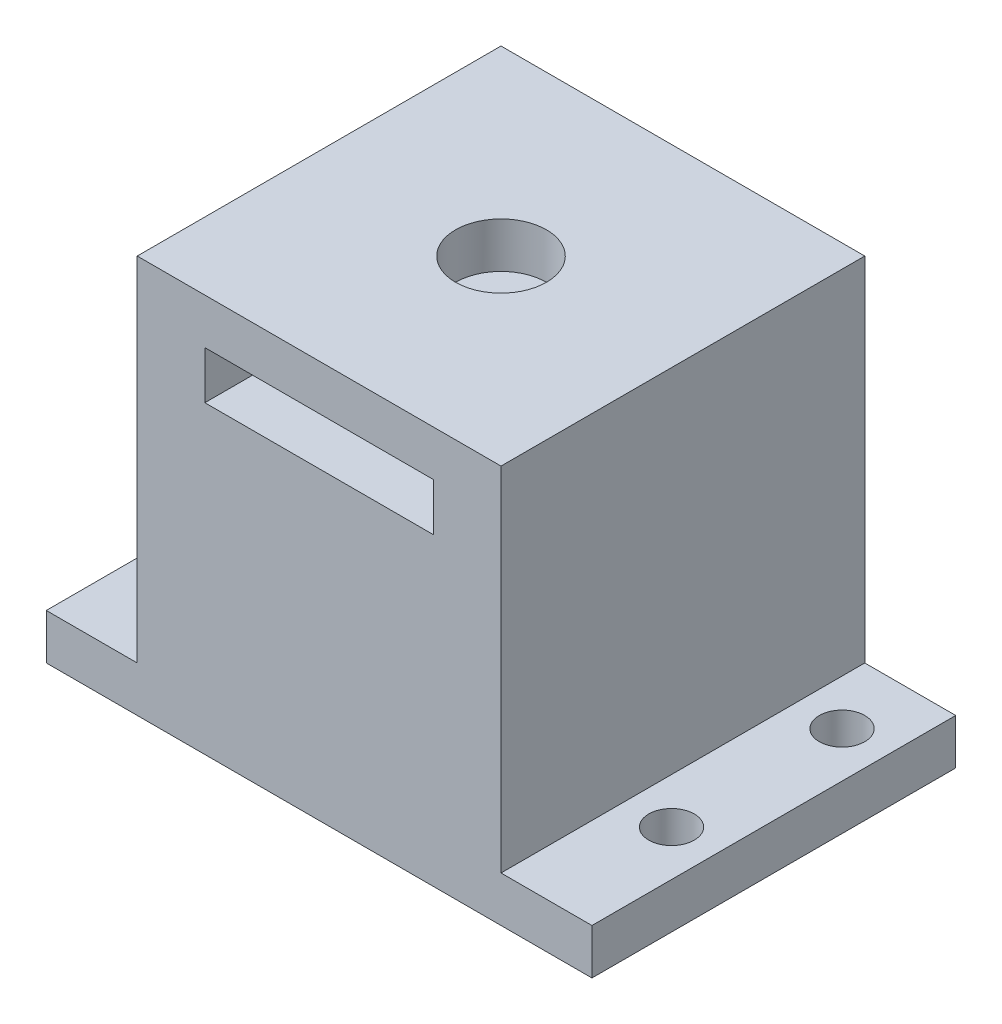
ISO-10303-21;
HEADER;
FILE_DESCRIPTION(('STEP AP214'),'2;1');
FILE_NAME('part.step','',(''),(''),'','','');
FILE_SCHEMA(('AUTOMOTIVE_DESIGN { 1 0 10303 214 1 1 1 1 }'));
ENDSEC;
DATA;
#1=APPLICATION_CONTEXT('core data for automotive mechanical design processes');
#2=APPLICATION_PROTOCOL_DEFINITION('international standard','automotive_design',2000,#1);
#3=PRODUCT_CONTEXT('',#1,'mechanical');
#4=PRODUCT('Part','Part','',(#3));
#5=PRODUCT_RELATED_PRODUCT_CATEGORY('part','',(#4));
#6=PRODUCT_DEFINITION_FORMATION('','',#4);
#7=PRODUCT_DEFINITION_CONTEXT('part definition',#1,'design');
#8=PRODUCT_DEFINITION('design','',#6,#7);
#9=PRODUCT_DEFINITION_SHAPE('','',#8);
#10=(LENGTH_UNIT() NAMED_UNIT(*) SI_UNIT(.MILLI.,.METRE.));
#11=(NAMED_UNIT(*) PLANE_ANGLE_UNIT() SI_UNIT($,.RADIAN.));
#12=(NAMED_UNIT(*) SI_UNIT($,.STERADIAN.) SOLID_ANGLE_UNIT());
#13=UNCERTAINTY_MEASURE_WITH_UNIT(LENGTH_MEASURE(1.E-05),#10,'distance_accuracy_value','');
#14=(GEOMETRIC_REPRESENTATION_CONTEXT(3) GLOBAL_UNCERTAINTY_ASSIGNED_CONTEXT((#13)) GLOBAL_UNIT_ASSIGNED_CONTEXT((#10,
#11,#12)) REPRESENTATION_CONTEXT('',''));
#15=CARTESIAN_POINT('',(0.,0.,0.));
#16=DIRECTION('',(0.,0.,1.));
#17=DIRECTION('',(1.,0.,0.));
#18=AXIS2_PLACEMENT_3D('',#15,#16,#17);
#19=CARTESIAN_POINT('',(16.,35.,16.));
#20=DIRECTION('',(-1.,0.,0.));
#21=DIRECTION('',(0.,0.,1.));
#22=AXIS2_PLACEMENT_3D('',#19,#20,#21);
#23=PLANE('',#22);
#24=DIRECTION('',(0.,0.,1.));
#25=VECTOR('',#24,1.);
#26=CARTESIAN_POINT('',(16.,4.,16.));
#27=LINE('',#26,#25);
#28=CARTESIAN_POINT('',(16.,4.,-16.));
#29=VERTEX_POINT('',#28);
#30=CARTESIAN_POINT('',(16.,4.,16.));
#31=VERTEX_POINT('',#30);
#32=EDGE_CURVE('E170',#29,#31,#27,.T.);
#33=ORIENTED_EDGE('',*,*,#32,.F.);
#34=DIRECTION('',(0.,-1.,0.));
#35=VECTOR('',#34,1.);
#36=CARTESIAN_POINT('',(16.,35.,-16.));
#37=LINE('',#36,#35);
#38=CARTESIAN_POINT('',(16.,35.,-16.));
#39=VERTEX_POINT('',#38);
#40=EDGE_CURVE('E11',#39,#29,#37,.T.);
#41=ORIENTED_EDGE('',*,*,#40,.F.);
#42=DIRECTION('',(0.,0.,-1.));
#43=VECTOR('',#42,1.);
#44=CARTESIAN_POINT('',(16.,35.,16.));
#45=LINE('',#44,#43);
#46=CARTESIAN_POINT('',(16.,35.,16.));
#47=VERTEX_POINT('',#46);
#48=EDGE_CURVE('E222',#47,#39,#45,.T.);
#49=ORIENTED_EDGE('',*,*,#48,.F.);
#50=DIRECTION('',(0.,-1.,0.));
#51=VECTOR('',#50,1.);
#52=CARTESIAN_POINT('',(16.,35.,16.));
#53=LINE('',#52,#51);
#54=EDGE_CURVE('E232',#47,#31,#53,.T.);
#55=ORIENTED_EDGE('',*,*,#54,.T.);
#56=EDGE_LOOP('',(#33,#41,#49,#55));
#57=FACE_BOUND('',#56,.T.);
#58=ADVANCED_FACE('F33',(#57),#23,.F.);
#59=CARTESIAN_POINT('',(-16.,35.,-16.));
#60=DIRECTION('',(0.,0.,1.));
#61=DIRECTION('',(1.,0.,0.));
#62=AXIS2_PLACEMENT_3D('',#59,#60,#61);
#63=PLANE('',#62);
#64=DIRECTION('',(-1.,0.,0.));
#65=VECTOR('',#64,1.);
#66=CARTESIAN_POINT('',(10.05,26.8,-16.));
#67=LINE('',#66,#65);
#68=CARTESIAN_POINT('',(10.05,26.8,-16.));
#69=VERTEX_POINT('',#68);
#70=CARTESIAN_POINT('',(-10.05,26.8,-16.));
#71=VERTEX_POINT('',#70);
#72=EDGE_CURVE('E143',#69,#71,#67,.T.);
#73=ORIENTED_EDGE('',*,*,#72,.F.);
#74=DIRECTION('',(0.,-1.,0.));
#75=VECTOR('',#74,1.);
#76=CARTESIAN_POINT('',(10.05,26.8,-16.));
#77=LINE('',#76,#75);
#78=CARTESIAN_POINT('',(10.05,31.,-16.));
#79=VERTEX_POINT('',#78);
#80=EDGE_CURVE('E47',#79,#69,#77,.T.);
#81=ORIENTED_EDGE('',*,*,#80,.F.);
#82=DIRECTION('',(1.,0.,0.));
#83=VECTOR('',#82,1.);
#84=CARTESIAN_POINT('',(10.05,31.,-16.));
#85=LINE('',#84,#83);
#86=CARTESIAN_POINT('',(-10.05,31.,-16.));
#87=VERTEX_POINT('',#86);
#88=EDGE_CURVE('E129',#87,#79,#85,.T.);
#89=ORIENTED_EDGE('',*,*,#88,.F.);
#90=DIRECTION('',(0.,1.,0.));
#91=VECTOR('',#90,1.);
#92=CARTESIAN_POINT('',(-10.05,26.8,-16.));
#93=LINE('',#92,#91);
#94=EDGE_CURVE('E149',#71,#87,#93,.T.);
#95=ORIENTED_EDGE('',*,*,#94,.F.);
#96=EDGE_LOOP('',(#73,#81,#89,#95));
#97=FACE_BOUND('',#96,.T.);
#98=DIRECTION('',(-1.,0.,0.));
#99=VECTOR('',#98,1.);
#100=CARTESIAN_POINT('',(-16.,0.,-16.));
#101=LINE('',#100,#99);
#102=CARTESIAN_POINT('',(24.,0.,-16.));
#103=VERTEX_POINT('',#102);
#104=CARTESIAN_POINT('',(-24.,0.,-16.));
#105=VERTEX_POINT('',#104);
#106=EDGE_CURVE('E219',#103,#105,#101,.T.);
#107=ORIENTED_EDGE('',*,*,#106,.T.);
#108=DIRECTION('',(0.,-1.,0.));
#109=VECTOR('',#108,1.);
#110=CARTESIAN_POINT('',(-24.,4.,-16.));
#111=LINE('',#110,#109);
#112=CARTESIAN_POINT('',(-24.,4.,-16.));
#113=VERTEX_POINT('',#112);
#114=EDGE_CURVE('E216',#113,#105,#111,.T.);
#115=ORIENTED_EDGE('',*,*,#114,.F.);
#116=DIRECTION('',(1.,0.,0.));
#117=VECTOR('',#116,1.);
#118=CARTESIAN_POINT('',(-16.,4.,-16.));
#119=LINE('',#118,#117);
#120=CARTESIAN_POINT('',(-16.,4.,-16.));
#121=VERTEX_POINT('',#120);
#122=EDGE_CURVE('E210',#113,#121,#119,.T.);
#123=ORIENTED_EDGE('',*,*,#122,.T.);
#124=DIRECTION('',(0.,-1.,0.));
#125=VECTOR('',#124,1.);
#126=CARTESIAN_POINT('',(-16.,35.,-16.));
#127=LINE('',#126,#125);
#128=CARTESIAN_POINT('',(-16.,35.,-16.));
#129=VERTEX_POINT('',#128);
#130=EDGE_CURVE('E40',#129,#121,#127,.T.);
#131=ORIENTED_EDGE('',*,*,#130,.F.);
#132=DIRECTION('',(-1.,0.,0.));
#133=VECTOR('',#132,1.);
#134=CARTESIAN_POINT('',(-16.,35.,-16.));
#135=LINE('',#134,#133);
#136=EDGE_CURVE('E225',#39,#129,#135,.T.);
#137=ORIENTED_EDGE('',*,*,#136,.F.);
#138=ORIENTED_EDGE('',*,*,#40,.T.);
#139=DIRECTION('',(-1.,0.,0.));
#140=VECTOR('',#139,1.);
#141=CARTESIAN_POINT('',(16.,4.,-16.));
#142=LINE('',#141,#140);
#143=CARTESIAN_POINT('',(24.,4.,-16.));
#144=VERTEX_POINT('',#143);
#145=EDGE_CURVE('E173',#144,#29,#142,.T.);
#146=ORIENTED_EDGE('',*,*,#145,.F.);
#147=DIRECTION('',(0.,-1.,0.));
#148=VECTOR('',#147,1.);
#149=CARTESIAN_POINT('',(24.,4.,-16.));
#150=LINE('',#149,#148);
#151=EDGE_CURVE('E180',#144,#103,#150,.T.);
#152=ORIENTED_EDGE('',*,*,#151,.T.);
#153=EDGE_LOOP('',(#107,#115,#123,#131,#137,#138,#146,#152));
#154=FACE_BOUND('',#153,.T.);
#155=ADVANCED_FACE('F245',(#97,#154),#63,.F.);
#156=CARTESIAN_POINT('',(-16.,35.,16.));
#157=DIRECTION('',(1.,0.,0.));
#158=DIRECTION('',(0.,0.,-1.));
#159=AXIS2_PLACEMENT_3D('',#156,#157,#158);
#160=PLANE('',#159);
#161=ORIENTED_EDGE('',*,*,#130,.T.);
#162=DIRECTION('',(0.,0.,1.));
#163=VECTOR('',#162,1.);
#164=CARTESIAN_POINT('',(-16.,4.,16.));
#165=LINE('',#164,#163);
#166=CARTESIAN_POINT('',(-16.,4.,16.));
#167=VERTEX_POINT('',#166);
#168=EDGE_CURVE('E201',#121,#167,#165,.T.);
#169=ORIENTED_EDGE('',*,*,#168,.T.);
#170=DIRECTION('',(0.,-1.,0.));
#171=VECTOR('',#170,1.);
#172=CARTESIAN_POINT('',(-16.,35.,16.));
#173=LINE('',#172,#171);
#174=CARTESIAN_POINT('',(-16.,35.,16.));
#175=VERTEX_POINT('',#174);
#176=EDGE_CURVE('E236',#175,#167,#173,.T.);
#177=ORIENTED_EDGE('',*,*,#176,.F.);
#178=DIRECTION('',(0.,0.,1.));
#179=VECTOR('',#178,1.);
#180=CARTESIAN_POINT('',(-16.,35.,16.));
#181=LINE('',#180,#179);
#182=EDGE_CURVE('E228',#129,#175,#181,.T.);
#183=ORIENTED_EDGE('',*,*,#182,.F.);
#184=EDGE_LOOP('',(#161,#169,#177,#183));
#185=FACE_BOUND('',#184,.T.);
#186=ADVANCED_FACE('F242',(#185),#160,.F.);
#187=CARTESIAN_POINT('',(-16.,35.,16.));
#188=DIRECTION('',(0.,0.,-1.));
#189=DIRECTION('',(-1.,0.,0.));
#190=AXIS2_PLACEMENT_3D('',#187,#188,#189);
#191=PLANE('',#190);
#192=DIRECTION('',(-1.,0.,0.));
#193=VECTOR('',#192,1.);
#194=CARTESIAN_POINT('',(10.05,31.,16.));
#195=LINE('',#194,#193);
#196=CARTESIAN_POINT('',(10.05,31.,16.));
#197=VERTEX_POINT('',#196);
#198=CARTESIAN_POINT('',(-10.05,31.,16.));
#199=VERTEX_POINT('',#198);
#200=EDGE_CURVE('E141',#197,#199,#195,.T.);
#201=ORIENTED_EDGE('',*,*,#200,.F.);
#202=DIRECTION('',(0.,1.,0.));
#203=VECTOR('',#202,1.);
#204=CARTESIAN_POINT('',(10.05,26.8,16.));
#205=LINE('',#204,#203);
#206=CARTESIAN_POINT('',(10.05,26.8,16.));
#207=VERTEX_POINT('',#206);
#208=EDGE_CURVE('E123',#207,#197,#205,.T.);
#209=ORIENTED_EDGE('',*,*,#208,.F.);
#210=DIRECTION('',(1.,0.,0.));
#211=VECTOR('',#210,1.);
#212=CARTESIAN_POINT('',(10.05,26.8,16.));
#213=LINE('',#212,#211);
#214=CARTESIAN_POINT('',(-10.05,26.8,16.));
#215=VERTEX_POINT('',#214);
#216=EDGE_CURVE('E132',#215,#207,#213,.T.);
#217=ORIENTED_EDGE('',*,*,#216,.F.);
#218=DIRECTION('',(0.,-1.,0.));
#219=VECTOR('',#218,1.);
#220=CARTESIAN_POINT('',(-10.05,26.8,16.));
#221=LINE('',#220,#219);
#222=EDGE_CURVE('E55',#199,#215,#221,.T.);
#223=ORIENTED_EDGE('',*,*,#222,.F.);
#224=EDGE_LOOP('',(#201,#209,#217,#223));
#225=FACE_BOUND('',#224,.T.);
#226=DIRECTION('',(1.,0.,0.));
#227=VECTOR('',#226,1.);
#228=CARTESIAN_POINT('',(-16.,0.,16.));
#229=LINE('',#228,#227);
#230=CARTESIAN_POINT('',(-24.,0.,16.));
#231=VERTEX_POINT('',#230);
#232=CARTESIAN_POINT('',(24.,0.,16.));
#233=VERTEX_POINT('',#232);
#234=EDGE_CURVE('E226',#231,#233,#229,.T.);
#235=ORIENTED_EDGE('',*,*,#234,.T.);
#236=DIRECTION('',(0.,-1.,0.));
#237=VECTOR('',#236,1.);
#238=CARTESIAN_POINT('',(24.,4.,16.));
#239=LINE('',#238,#237);
#240=CARTESIAN_POINT('',(24.,4.,16.));
#241=VERTEX_POINT('',#240);
#242=EDGE_CURVE('E183',#241,#233,#239,.T.);
#243=ORIENTED_EDGE('',*,*,#242,.F.);
#244=DIRECTION('',(1.,0.,0.));
#245=VECTOR('',#244,1.);
#246=CARTESIAN_POINT('',(16.,4.,16.));
#247=LINE('',#246,#245);
#248=EDGE_CURVE('E178',#31,#241,#247,.T.);
#249=ORIENTED_EDGE('',*,*,#248,.F.);
#250=ORIENTED_EDGE('',*,*,#54,.F.);
#251=DIRECTION('',(1.,0.,0.));
#252=VECTOR('',#251,1.);
#253=CARTESIAN_POINT('',(-16.,35.,16.));
#254=LINE('',#253,#252);
#255=EDGE_CURVE('E230',#175,#47,#254,.T.);
#256=ORIENTED_EDGE('',*,*,#255,.F.);
#257=ORIENTED_EDGE('',*,*,#176,.T.);
#258=DIRECTION('',(-1.,0.,0.));
#259=VECTOR('',#258,1.);
#260=CARTESIAN_POINT('',(-16.,4.,16.));
#261=LINE('',#260,#259);
#262=CARTESIAN_POINT('',(-24.,4.,16.));
#263=VERTEX_POINT('',#262);
#264=EDGE_CURVE('E204',#167,#263,#261,.T.);
#265=ORIENTED_EDGE('',*,*,#264,.T.);
#266=DIRECTION('',(0.,-1.,0.));
#267=VECTOR('',#266,1.);
#268=CARTESIAN_POINT('',(-24.,4.,16.));
#269=LINE('',#268,#267);
#270=EDGE_CURVE('E213',#263,#231,#269,.T.);
#271=ORIENTED_EDGE('',*,*,#270,.T.);
#272=EDGE_LOOP('',(#235,#243,#249,#250,#256,#257,#265,#271));
#273=FACE_BOUND('',#272,.T.);
#274=ADVANCED_FACE('F138',(#225,#273),#191,.F.);
#275=CARTESIAN_POINT('',(0.,35.,0.));
#276=DIRECTION('',(0.,-1.,0.));
#277=DIRECTION('',(0.,0.,-1.));
#278=AXIS2_PLACEMENT_3D('',#275,#276,#277);
#279=PLANE('',#278);
#280=CARTESIAN_POINT('',(0.,35.,0.));
#281=DIRECTION('',(0.,1.,0.));
#282=DIRECTION('',(0.,0.,1.));
#283=AXIS2_PLACEMENT_3D('',#280,#281,#282);
#284=CIRCLE('',#283,4.);
#285=CARTESIAN_POINT('',(0.,35.,4.));
#286=VERTEX_POINT('',#285);
#287=EDGE_CURVE('E419',#286,#286,#284,.T.);
#288=ORIENTED_EDGE('',*,*,#287,.F.);
#289=EDGE_LOOP('',(#288));
#290=FACE_BOUND('',#289,.T.);
#291=ORIENTED_EDGE('',*,*,#48,.T.);
#292=ORIENTED_EDGE('',*,*,#136,.T.);
#293=ORIENTED_EDGE('',*,*,#182,.T.);
#294=ORIENTED_EDGE('',*,*,#255,.T.);
#295=EDGE_LOOP('',(#291,#292,#293,#294));
#296=FACE_BOUND('',#295,.T.);
#297=ADVANCED_FACE('F256',(#290,#296),#279,.F.);
#298=CARTESIAN_POINT('',(0.,0.,0.));
#299=DIRECTION('',(0.,-1.,0.));
#300=DIRECTION('',(0.,0.,-1.));
#301=AXIS2_PLACEMENT_3D('',#298,#299,#300);
#302=PLANE('',#301);
#303=ORIENTED_EDGE('',*,*,#106,.F.);
#304=DIRECTION('',(0.,0.,-1.));
#305=VECTOR('',#304,1.);
#306=CARTESIAN_POINT('',(24.,0.,16.));
#307=LINE('',#306,#305);
#308=EDGE_CURVE('E167',#233,#103,#307,.T.);
#309=ORIENTED_EDGE('',*,*,#308,.F.);
#310=ORIENTED_EDGE('',*,*,#234,.F.);
#311=DIRECTION('',(0.,0.,-1.));
#312=VECTOR('',#311,1.);
#313=CARTESIAN_POINT('',(-24.,0.,16.));
#314=LINE('',#313,#312);
#315=EDGE_CURVE('E198',#231,#105,#314,.T.);
#316=ORIENTED_EDGE('',*,*,#315,.T.);
#317=EDGE_LOOP('',(#303,#309,#310,#316));
#318=FACE_BOUND('',#317,.T.);
#319=CARTESIAN_POINT('',(-20.,0.,-10.));
#320=DIRECTION('',(0.,-1.,0.));
#321=DIRECTION('',(0.,0.,-1.));
#322=AXIS2_PLACEMENT_3D('',#319,#320,#321);
#323=CIRCLE('',#322,2.);
#324=CARTESIAN_POINT('',(-20.,0.,-12.));
#325=VERTEX_POINT('',#324);
#326=EDGE_CURVE('E186',#325,#325,#323,.T.);
#327=ORIENTED_EDGE('',*,*,#326,.F.);
#328=EDGE_LOOP('',(#327));
#329=FACE_BOUND('',#328,.T.);
#330=CARTESIAN_POINT('',(-20.,0.,5.));
#331=DIRECTION('',(0.,-1.,0.));
#332=DIRECTION('',(0.,0.,-1.));
#333=AXIS2_PLACEMENT_3D('',#330,#331,#332);
#334=CIRCLE('',#333,2.);
#335=CARTESIAN_POINT('',(-20.,0.,3.));
#336=VERTEX_POINT('',#335);
#337=EDGE_CURVE('E192',#336,#336,#334,.T.);
#338=ORIENTED_EDGE('',*,*,#337,.F.);
#339=EDGE_LOOP('',(#338));
#340=FACE_BOUND('',#339,.T.);
#341=CARTESIAN_POINT('',(20.,0.,5.));
#342=DIRECTION('',(0.,1.,0.));
#343=DIRECTION('',(0.,0.,-1.));
#344=AXIS2_PLACEMENT_3D('',#341,#342,#343);
#345=CIRCLE('',#344,2.);
#346=CARTESIAN_POINT('',(20.,0.,3.));
#347=VERTEX_POINT('',#346);
#348=EDGE_CURVE('E161',#347,#347,#345,.T.);
#349=ORIENTED_EDGE('',*,*,#348,.T.);
#350=EDGE_LOOP('',(#349));
#351=FACE_BOUND('',#350,.T.);
#352=CARTESIAN_POINT('',(20.,0.,-10.));
#353=DIRECTION('',(0.,1.,0.));
#354=DIRECTION('',(0.,0.,-1.));
#355=AXIS2_PLACEMENT_3D('',#352,#353,#354);
#356=CIRCLE('',#355,2.);
#357=CARTESIAN_POINT('',(20.,0.,-12.));
#358=VERTEX_POINT('',#357);
#359=EDGE_CURVE('E135',#358,#358,#356,.T.);
#360=ORIENTED_EDGE('',*,*,#359,.T.);
#361=EDGE_LOOP('',(#360));
#362=FACE_BOUND('',#361,.T.);
#363=ADVANCED_FACE('F272',(#318,#329,#340,#351,#362),#302,.T.);
#364=CARTESIAN_POINT('',(-24.,4.,16.));
#365=DIRECTION('',(-1.,0.,0.));
#366=DIRECTION('',(0.,0.,1.));
#367=AXIS2_PLACEMENT_3D('',#364,#365,#366);
#368=PLANE('',#367);
#369=ORIENTED_EDGE('',*,*,#315,.F.);
#370=ORIENTED_EDGE('',*,*,#270,.F.);
#371=DIRECTION('',(0.,0.,-1.));
#372=VECTOR('',#371,1.);
#373=CARTESIAN_POINT('',(-24.,4.,16.));
#374=LINE('',#373,#372);
#375=EDGE_CURVE('E207',#263,#113,#374,.T.);
#376=ORIENTED_EDGE('',*,*,#375,.T.);
#377=ORIENTED_EDGE('',*,*,#114,.T.);
#378=EDGE_LOOP('',(#369,#370,#376,#377));
#379=FACE_BOUND('',#378,.T.);
#380=ADVANCED_FACE('F271',(#379),#368,.T.);
#381=CARTESIAN_POINT('',(0.,4.,0.));
#382=DIRECTION('',(0.,1.,0.));
#383=DIRECTION('',(0.,0.,1.));
#384=AXIS2_PLACEMENT_3D('',#381,#382,#383);
#385=PLANE('',#384);
#386=CARTESIAN_POINT('',(-20.,4.,-10.));
#387=DIRECTION('',(0.,-1.,0.));
#388=DIRECTION('',(0.,0.,-1.));
#389=AXIS2_PLACEMENT_3D('',#386,#387,#388);
#390=CIRCLE('',#389,2.);
#391=CARTESIAN_POINT('',(-20.,4.,-12.));
#392=VERTEX_POINT('',#391);
#393=EDGE_CURVE('E189',#392,#392,#390,.T.);
#394=ORIENTED_EDGE('',*,*,#393,.T.);
#395=EDGE_LOOP('',(#394));
#396=FACE_BOUND('',#395,.T.);
#397=CARTESIAN_POINT('',(-20.,4.,5.));
#398=DIRECTION('',(0.,-1.,0.));
#399=DIRECTION('',(0.,0.,-1.));
#400=AXIS2_PLACEMENT_3D('',#397,#398,#399);
#401=CIRCLE('',#400,2.);
#402=CARTESIAN_POINT('',(-20.,4.,3.));
#403=VERTEX_POINT('',#402);
#404=EDGE_CURVE('E195',#403,#403,#401,.T.);
#405=ORIENTED_EDGE('',*,*,#404,.T.);
#406=EDGE_LOOP('',(#405));
#407=FACE_BOUND('',#406,.T.);
#408=ORIENTED_EDGE('',*,*,#168,.F.);
#409=ORIENTED_EDGE('',*,*,#122,.F.);
#410=ORIENTED_EDGE('',*,*,#375,.F.);
#411=ORIENTED_EDGE('',*,*,#264,.F.);
#412=EDGE_LOOP('',(#408,#409,#410,#411));
#413=FACE_BOUND('',#412,.T.);
#414=ADVANCED_FACE('F249',(#396,#407,#413),#385,.T.);
#415=CARTESIAN_POINT('',(-20.,4.,5.));
#416=DIRECTION('',(0.,-1.,0.));
#417=DIRECTION('',(0.,0.,-1.));
#418=AXIS2_PLACEMENT_3D('',#415,#416,#417);
#419=CYLINDRICAL_SURFACE('',#418,2.);
#420=ORIENTED_EDGE('',*,*,#404,.F.);
#421=EDGE_LOOP('',(#420));
#422=FACE_BOUND('',#421,.T.);
#423=ORIENTED_EDGE('',*,*,#337,.T.);
#424=EDGE_LOOP('',(#423));
#425=FACE_BOUND('',#424,.T.);
#426=ADVANCED_FACE('F316',(#422,#425),#419,.F.);
#427=CARTESIAN_POINT('',(-20.,4.,-10.));
#428=DIRECTION('',(0.,-1.,0.));
#429=DIRECTION('',(0.,0.,-1.));
#430=AXIS2_PLACEMENT_3D('',#427,#428,#429);
#431=CYLINDRICAL_SURFACE('',#430,2.);
#432=ORIENTED_EDGE('',*,*,#393,.F.);
#433=EDGE_LOOP('',(#432));
#434=FACE_BOUND('',#433,.T.);
#435=ORIENTED_EDGE('',*,*,#326,.T.);
#436=EDGE_LOOP('',(#435));
#437=FACE_BOUND('',#436,.T.);
#438=ADVANCED_FACE('F320',(#434,#437),#431,.F.);
#439=CARTESIAN_POINT('',(0.,4.,0.));
#440=DIRECTION('',(0.,1.,0.));
#441=DIRECTION('',(0.,0.,1.));
#442=AXIS2_PLACEMENT_3D('',#439,#440,#441);
#443=PLANE('',#442);
#444=CARTESIAN_POINT('',(20.,4.,5.));
#445=DIRECTION('',(0.,1.,0.));
#446=DIRECTION('',(0.,0.,-1.));
#447=AXIS2_PLACEMENT_3D('',#444,#445,#446);
#448=CIRCLE('',#447,2.);
#449=CARTESIAN_POINT('',(20.,4.,3.));
#450=VERTEX_POINT('',#449);
#451=EDGE_CURVE('E164',#450,#450,#448,.T.);
#452=ORIENTED_EDGE('',*,*,#451,.F.);
#453=EDGE_LOOP('',(#452));
#454=FACE_BOUND('',#453,.T.);
#455=ORIENTED_EDGE('',*,*,#32,.T.);
#456=ORIENTED_EDGE('',*,*,#248,.T.);
#457=DIRECTION('',(0.,0.,-1.));
#458=VECTOR('',#457,1.);
#459=CARTESIAN_POINT('',(24.,4.,16.));
#460=LINE('',#459,#458);
#461=EDGE_CURVE('E176',#241,#144,#460,.T.);
#462=ORIENTED_EDGE('',*,*,#461,.T.);
#463=ORIENTED_EDGE('',*,*,#145,.T.);
#464=EDGE_LOOP('',(#455,#456,#462,#463));
#465=FACE_BOUND('',#464,.T.);
#466=CARTESIAN_POINT('',(20.,4.,-10.));
#467=DIRECTION('',(0.,1.,0.));
#468=DIRECTION('',(0.,0.,-1.));
#469=AXIS2_PLACEMENT_3D('',#466,#467,#468);
#470=CIRCLE('',#469,2.);
#471=CARTESIAN_POINT('',(20.,4.,-12.));
#472=VERTEX_POINT('',#471);
#473=EDGE_CURVE('E158',#472,#472,#470,.T.);
#474=ORIENTED_EDGE('',*,*,#473,.F.);
#475=EDGE_LOOP('',(#474));
#476=FACE_BOUND('',#475,.T.);
#477=ADVANCED_FACE('F261',(#454,#465,#476),#443,.T.);
#478=CARTESIAN_POINT('',(24.,4.,16.));
#479=DIRECTION('',(-1.,0.,0.));
#480=DIRECTION('',(0.,0.,1.));
#481=AXIS2_PLACEMENT_3D('',#478,#479,#480);
#482=PLANE('',#481);
#483=ORIENTED_EDGE('',*,*,#308,.T.);
#484=ORIENTED_EDGE('',*,*,#151,.F.);
#485=ORIENTED_EDGE('',*,*,#461,.F.);
#486=ORIENTED_EDGE('',*,*,#242,.T.);
#487=EDGE_LOOP('',(#483,#484,#485,#486));
#488=FACE_BOUND('',#487,.T.);
#489=ADVANCED_FACE('F267',(#488),#482,.F.);
#490=CARTESIAN_POINT('',(20.,4.,5.));
#491=DIRECTION('',(0.,-1.,0.));
#492=DIRECTION('',(0.,0.,-1.));
#493=AXIS2_PLACEMENT_3D('',#490,#491,#492);
#494=CYLINDRICAL_SURFACE('',#493,2.);
#495=ORIENTED_EDGE('',*,*,#451,.T.);
#496=EDGE_LOOP('',(#495));
#497=FACE_BOUND('',#496,.T.);
#498=ORIENTED_EDGE('',*,*,#348,.F.);
#499=EDGE_LOOP('',(#498));
#500=FACE_BOUND('',#499,.T.);
#501=ADVANCED_FACE('F286',(#497,#500),#494,.F.);
#502=CARTESIAN_POINT('',(20.,4.,-10.));
#503=DIRECTION('',(0.,-1.,0.));
#504=DIRECTION('',(0.,0.,-1.));
#505=AXIS2_PLACEMENT_3D('',#502,#503,#504);
#506=CYLINDRICAL_SURFACE('',#505,2.);
#507=ORIENTED_EDGE('',*,*,#473,.T.);
#508=EDGE_LOOP('',(#507));
#509=FACE_BOUND('',#508,.T.);
#510=ORIENTED_EDGE('',*,*,#359,.F.);
#511=EDGE_LOOP('',(#510));
#512=FACE_BOUND('',#511,.T.);
#513=ADVANCED_FACE('F284',(#509,#512),#506,.F.);
#514=CARTESIAN_POINT('',(10.05,26.8,16.001));
#515=DIRECTION('',(1.,0.,0.));
#516=DIRECTION('',(0.,0.,-1.));
#517=AXIS2_PLACEMENT_3D('',#514,#515,#516);
#518=PLANE('',#517);
#519=ORIENTED_EDGE('',*,*,#208,.T.);
#520=DIRECTION('',(0.,0.,-1.));
#521=VECTOR('',#520,1.);
#522=CARTESIAN_POINT('',(10.05,31.,16.001));
#523=LINE('',#522,#521);
#524=EDGE_CURVE('E136',#197,#79,#523,.T.);
#525=ORIENTED_EDGE('',*,*,#524,.T.);
#526=ORIENTED_EDGE('',*,*,#80,.T.);
#527=DIRECTION('',(0.,0.,-1.));
#528=VECTOR('',#527,1.);
#529=CARTESIAN_POINT('',(10.05,26.8,16.001));
#530=LINE('',#529,#528);
#531=EDGE_CURVE('E119',#207,#69,#530,.T.);
#532=ORIENTED_EDGE('',*,*,#531,.F.);
#533=EDGE_LOOP('',(#519,#525,#526,#532));
#534=FACE_BOUND('',#533,.T.);
#535=ADVANCED_FACE('F121',(#534),#518,.F.);
#536=CARTESIAN_POINT('',(10.05,31.,16.001));
#537=DIRECTION('',(0.,1.,0.));
#538=DIRECTION('',(-1.,0.,0.));
#539=AXIS2_PLACEMENT_3D('',#536,#537,#538);
#540=PLANE('',#539);
#541=CARTESIAN_POINT('',(0.,31.,0.));
#542=DIRECTION('',(0.,1.,0.));
#543=DIRECTION('',(-1.,0.,0.));
#544=AXIS2_PLACEMENT_3D('',#541,#542,#543);
#545=CIRCLE('',#544,4.);
#546=CARTESIAN_POINT('',(-4.,31.,0.));
#547=VERTEX_POINT('',#546);
#548=EDGE_CURVE('E422',#547,#547,#545,.F.);
#549=ORIENTED_EDGE('',*,*,#548,.F.);
#550=EDGE_LOOP('',(#549));
#551=FACE_BOUND('',#550,.T.);
#552=ORIENTED_EDGE('',*,*,#200,.T.);
#553=DIRECTION('',(0.,0.,-1.));
#554=VECTOR('',#553,1.);
#555=CARTESIAN_POINT('',(-10.05,31.,16.001));
#556=LINE('',#555,#554);
#557=EDGE_CURVE('E155',#199,#87,#556,.T.);
#558=ORIENTED_EDGE('',*,*,#557,.T.);
#559=ORIENTED_EDGE('',*,*,#88,.T.);
#560=ORIENTED_EDGE('',*,*,#524,.F.);
#561=EDGE_LOOP('',(#552,#558,#559,#560));
#562=FACE_BOUND('',#561,.T.);
#563=ADVANCED_FACE('F293',(#551,#562),#540,.F.);
#564=CARTESIAN_POINT('',(-10.05,26.8,16.001));
#565=DIRECTION('',(-1.,0.,0.));
#566=DIRECTION('',(0.,-1.,0.));
#567=AXIS2_PLACEMENT_3D('',#564,#565,#566);
#568=PLANE('',#567);
#569=ORIENTED_EDGE('',*,*,#222,.T.);
#570=DIRECTION('',(0.,0.,-1.));
#571=VECTOR('',#570,1.);
#572=CARTESIAN_POINT('',(-10.05,26.8,16.001));
#573=LINE('',#572,#571);
#574=EDGE_CURVE('E128',#215,#71,#573,.T.);
#575=ORIENTED_EDGE('',*,*,#574,.T.);
#576=ORIENTED_EDGE('',*,*,#94,.T.);
#577=ORIENTED_EDGE('',*,*,#557,.F.);
#578=EDGE_LOOP('',(#569,#575,#576,#577));
#579=FACE_BOUND('',#578,.T.);
#580=ADVANCED_FACE('F375',(#579),#568,.F.);
#581=CARTESIAN_POINT('',(10.05,26.8,16.001));
#582=DIRECTION('',(0.,-1.,0.));
#583=DIRECTION('',(0.,0.,-1.));
#584=AXIS2_PLACEMENT_3D('',#581,#582,#583);
#585=PLANE('',#584);
#586=ORIENTED_EDGE('',*,*,#216,.T.);
#587=ORIENTED_EDGE('',*,*,#531,.T.);
#588=ORIENTED_EDGE('',*,*,#72,.T.);
#589=ORIENTED_EDGE('',*,*,#574,.F.);
#590=EDGE_LOOP('',(#586,#587,#588,#589));
#591=FACE_BOUND('',#590,.T.);
#592=ADVANCED_FACE('F133',(#591),#585,.F.);
#593=CARTESIAN_POINT('',(0.,-0.001000000000001,0.));
#594=DIRECTION('',(0.,1.,0.));
#595=DIRECTION('',(0.,0.,1.));
#596=AXIS2_PLACEMENT_3D('',#593,#594,#595);
#597=CYLINDRICAL_SURFACE('',#596,4.);
#598=ORIENTED_EDGE('',*,*,#287,.T.);
#599=EDGE_LOOP('',(#598));
#600=FACE_BOUND('',#599,.T.);
#601=ORIENTED_EDGE('',*,*,#548,.T.);
#602=EDGE_LOOP('',(#601));
#603=FACE_BOUND('',#602,.T.);
#604=ADVANCED_FACE('F388',(#600,#603),#597,.F.);
#605=CLOSED_SHELL('',(#58,#155,#186,#274,#297,#363,#380,#414,#426,#438,#477,#489,#501,#513,#535,
#563,#580,#592,#604));
#606=MANIFOLD_SOLID_BREP('B2',#605);
#607=ADVANCED_BREP_SHAPE_REPRESENTATION('',(#18,#606),#14);
#608=SHAPE_DEFINITION_REPRESENTATION(#9,#607);
ENDSEC;
END-ISO-10303-21;
